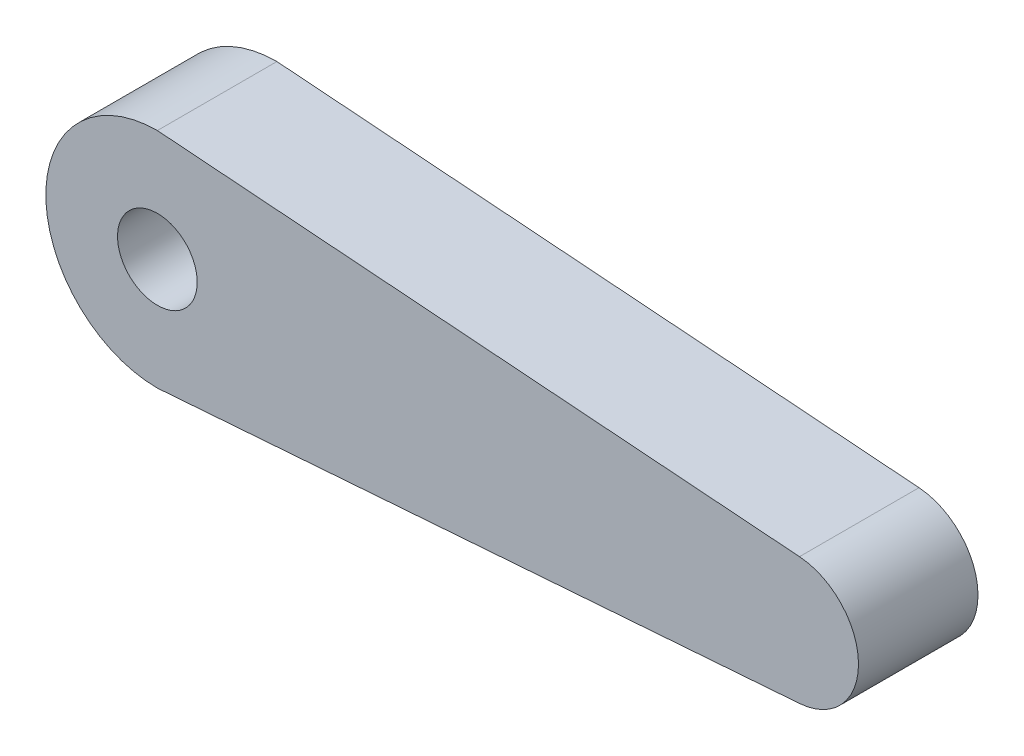
ISO-10303-21;
HEADER;
FILE_DESCRIPTION(('STEP AP214'),'2;1');
FILE_NAME('part.step','',(''),(''),'','','');
FILE_SCHEMA(('AUTOMOTIVE_DESIGN { 1 0 10303 214 1 1 1 1 }'));
ENDSEC;
DATA;
#1=APPLICATION_CONTEXT('core data for automotive mechanical design processes');
#2=APPLICATION_PROTOCOL_DEFINITION('international standard','automotive_design',2000,#1);
#3=PRODUCT_CONTEXT('',#1,'mechanical');
#4=PRODUCT('Part','Part','',(#3));
#5=PRODUCT_RELATED_PRODUCT_CATEGORY('part','',(#4));
#6=PRODUCT_DEFINITION_FORMATION('','',#4);
#7=PRODUCT_DEFINITION_CONTEXT('part definition',#1,'design');
#8=PRODUCT_DEFINITION('design','',#6,#7);
#9=PRODUCT_DEFINITION_SHAPE('','',#8);
#10=(LENGTH_UNIT() NAMED_UNIT(*) SI_UNIT(.MILLI.,.METRE.));
#11=(NAMED_UNIT(*) PLANE_ANGLE_UNIT() SI_UNIT($,.RADIAN.));
#12=(NAMED_UNIT(*) SI_UNIT($,.STERADIAN.) SOLID_ANGLE_UNIT());
#13=UNCERTAINTY_MEASURE_WITH_UNIT(LENGTH_MEASURE(1.E-05),#10,'distance_accuracy_value','');
#14=(GEOMETRIC_REPRESENTATION_CONTEXT(3) GLOBAL_UNCERTAINTY_ASSIGNED_CONTEXT((#13)) GLOBAL_UNIT_ASSIGNED_CONTEXT((#10,
#11,#12)) REPRESENTATION_CONTEXT('',''));
#15=CARTESIAN_POINT('',(0.,0.,0.));
#16=DIRECTION('',(0.,0.,1.));
#17=DIRECTION('',(1.,0.,0.));
#18=AXIS2_PLACEMENT_3D('',#15,#16,#17);
#19=CARTESIAN_POINT('',(0.,0.,15.));
#20=DIRECTION('',(0.,0.,-1.));
#21=DIRECTION('',(-1.,0.,0.));
#22=AXIS2_PLACEMENT_3D('',#19,#20,#21);
#23=CYLINDRICAL_SURFACE('',#22,14.);
#24=CARTESIAN_POINT('',(0.,0.,0.));
#25=DIRECTION('',(0.,0.,1.));
#26=DIRECTION('',(1.,0.,0.));
#27=AXIS2_PLACEMENT_3D('',#24,#25,#26);
#28=CIRCLE('',#27,14.);
#29=CARTESIAN_POINT('',(0.,14.,0.));
#30=VERTEX_POINT('',#29);
#31=CARTESIAN_POINT('',(0.,-14.,0.));
#32=VERTEX_POINT('',#31);
#33=EDGE_CURVE('E95',#30,#32,#28,.T.);
#34=ORIENTED_EDGE('',*,*,#33,.T.);
#35=DIRECTION('',(0.,0.,-1.));
#36=VECTOR('',#35,1.);
#37=CARTESIAN_POINT('',(0.,-14.,15.));
#38=LINE('',#37,#36);
#39=CARTESIAN_POINT('',(0.,-14.,15.));
#40=VERTEX_POINT('',#39);
#41=EDGE_CURVE('E11',#40,#32,#38,.T.);
#42=ORIENTED_EDGE('',*,*,#41,.F.);
#43=CARTESIAN_POINT('',(0.,0.,15.));
#44=DIRECTION('',(0.,0.,1.));
#45=DIRECTION('',(1.,0.,0.));
#46=AXIS2_PLACEMENT_3D('',#43,#44,#45);
#47=CIRCLE('',#46,14.);
#48=CARTESIAN_POINT('',(0.,14.,15.));
#49=VERTEX_POINT('',#48);
#50=EDGE_CURVE('E83',#49,#40,#47,.T.);
#51=ORIENTED_EDGE('',*,*,#50,.F.);
#52=DIRECTION('',(0.,0.,-1.));
#53=VECTOR('',#52,1.);
#54=CARTESIAN_POINT('',(0.,14.,15.));
#55=LINE('',#54,#53);
#56=EDGE_CURVE('E91',#49,#30,#55,.T.);
#57=ORIENTED_EDGE('',*,*,#56,.T.);
#58=EDGE_LOOP('',(#34,#42,#51,#57));
#59=FACE_BOUND('',#58,.T.);
#60=ADVANCED_FACE('F32',(#59),#23,.T.);
#61=CARTESIAN_POINT('',(80.5961080068719,-7.97776003926811,15.));
#62=DIRECTION('',(-0.07451350085899,0.997220004908514,0.));
#63=DIRECTION('',(-0.997220004908514,-0.07451350085899,0.));
#64=AXIS2_PLACEMENT_3D('',#61,#62,#63);
#65=PLANE('',#64);
#66=DIRECTION('',(0.997220004908514,0.07451350085899,0.));
#67=VECTOR('',#66,1.);
#68=CARTESIAN_POINT('',(80.5961080068719,-7.97776003926811,0.));
#69=LINE('',#68,#67);
#70=CARTESIAN_POINT('',(80.5961080068719,-7.97776003926811,0.));
#71=VERTEX_POINT('',#70);
#72=EDGE_CURVE('E87',#32,#71,#69,.T.);
#73=ORIENTED_EDGE('',*,*,#72,.T.);
#74=DIRECTION('',(0.,0.,-1.));
#75=VECTOR('',#74,1.);
#76=CARTESIAN_POINT('',(80.5961080068719,-7.97776003926811,15.));
#77=LINE('',#76,#75);
#78=CARTESIAN_POINT('',(80.5961080068719,-7.97776003926811,15.));
#79=VERTEX_POINT('',#78);
#80=EDGE_CURVE('E40',#79,#71,#77,.T.);
#81=ORIENTED_EDGE('',*,*,#80,.F.);
#82=DIRECTION('',(0.997220004908514,0.07451350085899,0.));
#83=VECTOR('',#82,1.);
#84=CARTESIAN_POINT('',(80.5961080068719,-7.97776003926811,15.));
#85=LINE('',#84,#83);
#86=EDGE_CURVE('E78',#40,#79,#85,.T.);
#87=ORIENTED_EDGE('',*,*,#86,.F.);
#88=ORIENTED_EDGE('',*,*,#41,.T.);
#89=EDGE_LOOP('',(#73,#81,#87,#88));
#90=FACE_BOUND('',#89,.T.);
#91=ADVANCED_FACE('F86',(#90),#65,.F.);
#92=CARTESIAN_POINT('',(80.,0.,15.));
#93=DIRECTION('',(0.,0.,-1.));
#94=DIRECTION('',(-1.,0.,0.));
#95=AXIS2_PLACEMENT_3D('',#92,#93,#94);
#96=CYLINDRICAL_SURFACE('',#95,8.);
#97=CARTESIAN_POINT('',(80.,0.,0.));
#98=DIRECTION('',(0.,0.,1.));
#99=DIRECTION('',(-1.,0.,0.));
#100=AXIS2_PLACEMENT_3D('',#97,#98,#99);
#101=CIRCLE('',#100,8.);
#102=CARTESIAN_POINT('',(80.5961080068719,7.97776003926811,0.));
#103=VERTEX_POINT('',#102);
#104=EDGE_CURVE('E65',#71,#103,#101,.T.);
#105=ORIENTED_EDGE('',*,*,#104,.T.);
#106=DIRECTION('',(0.,0.,-1.));
#107=VECTOR('',#106,1.);
#108=CARTESIAN_POINT('',(80.5961080068719,7.97776003926811,15.));
#109=LINE('',#108,#107);
#110=CARTESIAN_POINT('',(80.5961080068719,7.97776003926811,15.));
#111=VERTEX_POINT('',#110);
#112=EDGE_CURVE('E88',#111,#103,#109,.T.);
#113=ORIENTED_EDGE('',*,*,#112,.F.);
#114=CARTESIAN_POINT('',(80.,0.,15.));
#115=DIRECTION('',(0.,0.,1.));
#116=DIRECTION('',(-1.,0.,0.));
#117=AXIS2_PLACEMENT_3D('',#114,#115,#116);
#118=CIRCLE('',#117,8.);
#119=EDGE_CURVE('E81',#79,#111,#118,.T.);
#120=ORIENTED_EDGE('',*,*,#119,.F.);
#121=ORIENTED_EDGE('',*,*,#80,.T.);
#122=EDGE_LOOP('',(#105,#113,#120,#121));
#123=FACE_BOUND('',#122,.T.);
#124=ADVANCED_FACE('F89',(#123),#96,.T.);
#125=CARTESIAN_POINT('',(80.5961080068719,7.97776003926811,15.));
#126=DIRECTION('',(-0.07451350085899,-0.997220004908514,0.));
#127=DIRECTION('',(0.997220004908514,-0.07451350085899,0.));
#128=AXIS2_PLACEMENT_3D('',#125,#126,#127);
#129=PLANE('',#128);
#130=DIRECTION('',(-0.997220004908514,0.07451350085899,0.));
#131=VECTOR('',#130,1.);
#132=CARTESIAN_POINT('',(80.5961080068719,7.97776003926811,0.));
#133=LINE('',#132,#131);
#134=EDGE_CURVE('E71',#103,#30,#133,.T.);
#135=ORIENTED_EDGE('',*,*,#134,.T.);
#136=ORIENTED_EDGE('',*,*,#56,.F.);
#137=DIRECTION('',(-0.997220004908514,0.07451350085899,0.));
#138=VECTOR('',#137,1.);
#139=CARTESIAN_POINT('',(80.5961080068719,7.97776003926811,15.));
#140=LINE('',#139,#138);
#141=EDGE_CURVE('E48',#111,#49,#140,.T.);
#142=ORIENTED_EDGE('',*,*,#141,.F.);
#143=ORIENTED_EDGE('',*,*,#112,.T.);
#144=EDGE_LOOP('',(#135,#136,#142,#143));
#145=FACE_BOUND('',#144,.T.);
#146=ADVANCED_FACE('F103',(#145),#129,.F.);
#147=CARTESIAN_POINT('',(0.,0.,15.));
#148=DIRECTION('',(0.,0.,1.));
#149=DIRECTION('',(1.,0.,0.));
#150=AXIS2_PLACEMENT_3D('',#147,#148,#149);
#151=PLANE('',#150);
#152=CARTESIAN_POINT('',(0.,0.,15.));
#153=DIRECTION('',(0.,0.,1.));
#154=DIRECTION('',(1.,0.,0.));
#155=AXIS2_PLACEMENT_3D('',#152,#153,#154);
#156=CIRCLE('',#155,5.);
#157=CARTESIAN_POINT('',(5.,0.,15.));
#158=VERTEX_POINT('',#157);
#159=EDGE_CURVE('E98',#158,#158,#156,.T.);
#160=ORIENTED_EDGE('',*,*,#159,.F.);
#161=EDGE_LOOP('',(#160));
#162=FACE_BOUND('',#161,.T.);
#163=ORIENTED_EDGE('',*,*,#50,.T.);
#164=ORIENTED_EDGE('',*,*,#86,.T.);
#165=ORIENTED_EDGE('',*,*,#119,.T.);
#166=ORIENTED_EDGE('',*,*,#141,.T.);
#167=EDGE_LOOP('',(#163,#164,#165,#166));
#168=FACE_BOUND('',#167,.T.);
#169=ADVANCED_FACE('F79',(#162,#168),#151,.T.);
#170=CARTESIAN_POINT('',(0.,0.,0.));
#171=DIRECTION('',(0.,0.,1.));
#172=DIRECTION('',(1.,0.,0.));
#173=AXIS2_PLACEMENT_3D('',#170,#171,#172);
#174=PLANE('',#173);
#175=CARTESIAN_POINT('',(0.,0.,0.));
#176=DIRECTION('',(0.,0.,1.));
#177=DIRECTION('',(1.,0.,0.));
#178=AXIS2_PLACEMENT_3D('',#175,#176,#177);
#179=CIRCLE('',#178,5.);
#180=CARTESIAN_POINT('',(5.,0.,0.));
#181=VERTEX_POINT('',#180);
#182=EDGE_CURVE('E111',#181,#181,#179,.T.);
#183=ORIENTED_EDGE('',*,*,#182,.T.);
#184=EDGE_LOOP('',(#183));
#185=FACE_BOUND('',#184,.T.);
#186=ORIENTED_EDGE('',*,*,#33,.F.);
#187=ORIENTED_EDGE('',*,*,#134,.F.);
#188=ORIENTED_EDGE('',*,*,#104,.F.);
#189=ORIENTED_EDGE('',*,*,#72,.F.);
#190=EDGE_LOOP('',(#186,#187,#188,#189));
#191=FACE_BOUND('',#190,.T.);
#192=ADVANCED_FACE('F106',(#185,#191),#174,.F.);
#193=CARTESIAN_POINT('',(0.,0.,0.));
#194=DIRECTION('',(0.,0.,1.));
#195=DIRECTION('',(1.,0.,0.));
#196=AXIS2_PLACEMENT_3D('',#193,#194,#195);
#197=CYLINDRICAL_SURFACE('',#196,5.);
#198=ORIENTED_EDGE('',*,*,#159,.T.);
#199=EDGE_LOOP('',(#198));
#200=FACE_BOUND('',#199,.T.);
#201=ORIENTED_EDGE('',*,*,#182,.F.);
#202=EDGE_LOOP('',(#201));
#203=FACE_BOUND('',#202,.T.);
#204=ADVANCED_FACE('F116',(#200,#203),#197,.F.);
#205=CLOSED_SHELL('',(#60,#91,#124,#146,#169,#192,#204));
#206=MANIFOLD_SOLID_BREP('B2',#205);
#207=ADVANCED_BREP_SHAPE_REPRESENTATION('',(#18,#206),#14);
#208=SHAPE_DEFINITION_REPRESENTATION(#9,#207);
ENDSEC;
END-ISO-10303-21;
